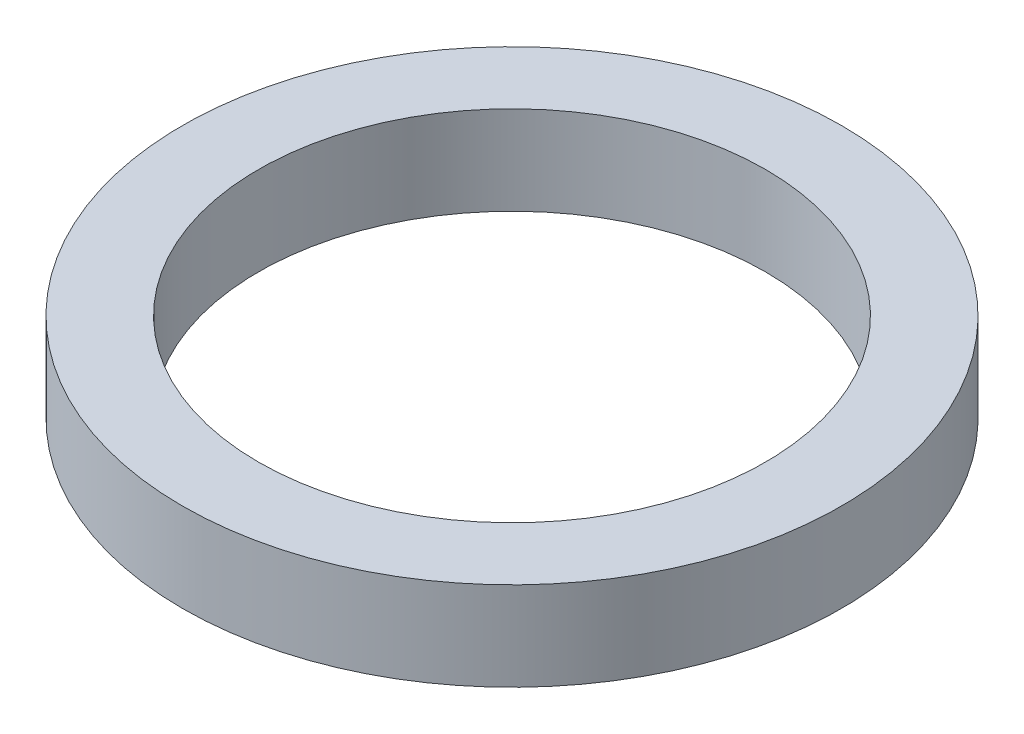
ISO-10303-21;
HEADER;
FILE_DESCRIPTION(('STEP AP214'),'2;1');
FILE_NAME('part.step','',(''),(''),'','','');
FILE_SCHEMA(('AUTOMOTIVE_DESIGN { 1 0 10303 214 1 1 1 1 }'));
ENDSEC;
DATA;
#1=APPLICATION_CONTEXT('core data for automotive mechanical design processes');
#2=APPLICATION_PROTOCOL_DEFINITION('international standard','automotive_design',2000,#1);
#3=PRODUCT_CONTEXT('',#1,'mechanical');
#4=PRODUCT('Part','Part','',(#3));
#5=PRODUCT_RELATED_PRODUCT_CATEGORY('part','',(#4));
#6=PRODUCT_DEFINITION_FORMATION('','',#4);
#7=PRODUCT_DEFINITION_CONTEXT('part definition',#1,'design');
#8=PRODUCT_DEFINITION('design','',#6,#7);
#9=PRODUCT_DEFINITION_SHAPE('','',#8);
#10=(LENGTH_UNIT() NAMED_UNIT(*) SI_UNIT(.MILLI.,.METRE.));
#11=(NAMED_UNIT(*) PLANE_ANGLE_UNIT() SI_UNIT($,.RADIAN.));
#12=(NAMED_UNIT(*) SI_UNIT($,.STERADIAN.) SOLID_ANGLE_UNIT());
#13=UNCERTAINTY_MEASURE_WITH_UNIT(LENGTH_MEASURE(1.E-05),#10,'distance_accuracy_value','');
#14=(GEOMETRIC_REPRESENTATION_CONTEXT(3) GLOBAL_UNCERTAINTY_ASSIGNED_CONTEXT((#13)) GLOBAL_UNIT_ASSIGNED_CONTEXT((#10,
#11,#12)) REPRESENTATION_CONTEXT('',''));
#15=CARTESIAN_POINT('',(0.,0.,0.));
#16=DIRECTION('',(0.,0.,1.));
#17=DIRECTION('',(1.,0.,0.));
#18=AXIS2_PLACEMENT_3D('',#15,#16,#17);
#19=CARTESIAN_POINT('',(0.,7.,0.));
#20=DIRECTION('',(0.,1.,0.));
#21=DIRECTION('',(0.,0.,1.));
#22=AXIS2_PLACEMENT_3D('',#19,#20,#21);
#23=PLANE('',#22);
#24=CARTESIAN_POINT('',(0.,7.,0.));
#25=DIRECTION('',(0.,1.,0.));
#26=DIRECTION('',(0.,0.,1.));
#27=AXIS2_PLACEMENT_3D('',#24,#25,#26);
#28=CIRCLE('',#27,26.);
#29=CARTESIAN_POINT('',(0.,7.,26.));
#30=VERTEX_POINT('',#29);
#31=EDGE_CURVE('E10',#30,#30,#28,.T.);
#32=ORIENTED_EDGE('',*,*,#31,.T.);
#33=EDGE_LOOP('',(#32));
#34=FACE_BOUND('',#33,.T.);
#35=CARTESIAN_POINT('',(0.,7.,0.));
#36=DIRECTION('',(0.,1.,0.));
#37=DIRECTION('',(0.,0.,1.));
#38=AXIS2_PLACEMENT_3D('',#35,#36,#37);
#39=CIRCLE('',#38,20.);
#40=CARTESIAN_POINT('',(0.,7.,20.));
#41=VERTEX_POINT('',#40);
#42=EDGE_CURVE('E42',#41,#41,#39,.T.);
#43=ORIENTED_EDGE('',*,*,#42,.F.);
#44=EDGE_LOOP('',(#43));
#45=FACE_BOUND('',#44,.T.);
#46=ADVANCED_FACE('F31',(#34,#45),#23,.T.);
#47=CARTESIAN_POINT('',(0.,0.,0.));
#48=DIRECTION('',(0.,1.,0.));
#49=DIRECTION('',(0.,0.,1.));
#50=AXIS2_PLACEMENT_3D('',#47,#48,#49);
#51=PLANE('',#50);
#52=CARTESIAN_POINT('',(0.,0.,0.));
#53=DIRECTION('',(0.,1.,0.));
#54=DIRECTION('',(0.,0.,1.));
#55=AXIS2_PLACEMENT_3D('',#52,#53,#54);
#56=CIRCLE('',#55,26.);
#57=CARTESIAN_POINT('',(0.,0.,26.));
#58=VERTEX_POINT('',#57);
#59=EDGE_CURVE('E35',#58,#58,#56,.T.);
#60=ORIENTED_EDGE('',*,*,#59,.F.);
#61=EDGE_LOOP('',(#60));
#62=FACE_BOUND('',#61,.T.);
#63=CARTESIAN_POINT('',(0.,0.,0.));
#64=DIRECTION('',(0.,1.,0.));
#65=DIRECTION('',(0.,0.,1.));
#66=AXIS2_PLACEMENT_3D('',#63,#64,#65);
#67=CIRCLE('',#66,20.);
#68=CARTESIAN_POINT('',(0.,0.,20.));
#69=VERTEX_POINT('',#68);
#70=EDGE_CURVE('E44',#69,#69,#67,.T.);
#71=ORIENTED_EDGE('',*,*,#70,.T.);
#72=EDGE_LOOP('',(#71));
#73=FACE_BOUND('',#72,.T.);
#74=ADVANCED_FACE('F54',(#62,#73),#51,.F.);
#75=CARTESIAN_POINT('',(0.,7.,0.));
#76=DIRECTION('',(0.,-1.,0.));
#77=DIRECTION('',(0.,0.,-1.));
#78=AXIS2_PLACEMENT_3D('',#75,#76,#77);
#79=CYLINDRICAL_SURFACE('',#78,26.);
#80=ORIENTED_EDGE('',*,*,#31,.F.);
#81=EDGE_LOOP('',(#80));
#82=FACE_BOUND('',#81,.T.);
#83=ORIENTED_EDGE('',*,*,#59,.T.);
#84=EDGE_LOOP('',(#83));
#85=FACE_BOUND('',#84,.T.);
#86=ADVANCED_FACE('F33',(#82,#85),#79,.T.);
#87=CARTESIAN_POINT('',(0.,7.,0.));
#88=DIRECTION('',(0.,-1.,0.));
#89=DIRECTION('',(0.,0.,-1.));
#90=AXIS2_PLACEMENT_3D('',#87,#88,#89);
#91=CYLINDRICAL_SURFACE('',#90,20.);
#92=ORIENTED_EDGE('',*,*,#42,.T.);
#93=EDGE_LOOP('',(#92));
#94=FACE_BOUND('',#93,.T.);
#95=ORIENTED_EDGE('',*,*,#70,.F.);
#96=EDGE_LOOP('',(#95));
#97=FACE_BOUND('',#96,.T.);
#98=ADVANCED_FACE('F50',(#94,#97),#91,.F.);
#99=CLOSED_SHELL('',(#46,#74,#86,#98));
#100=MANIFOLD_SOLID_BREP('B2',#99);
#101=ADVANCED_BREP_SHAPE_REPRESENTATION('',(#18,#100),#14);
#102=SHAPE_DEFINITION_REPRESENTATION(#9,#101);
ENDSEC;
END-ISO-10303-21;
